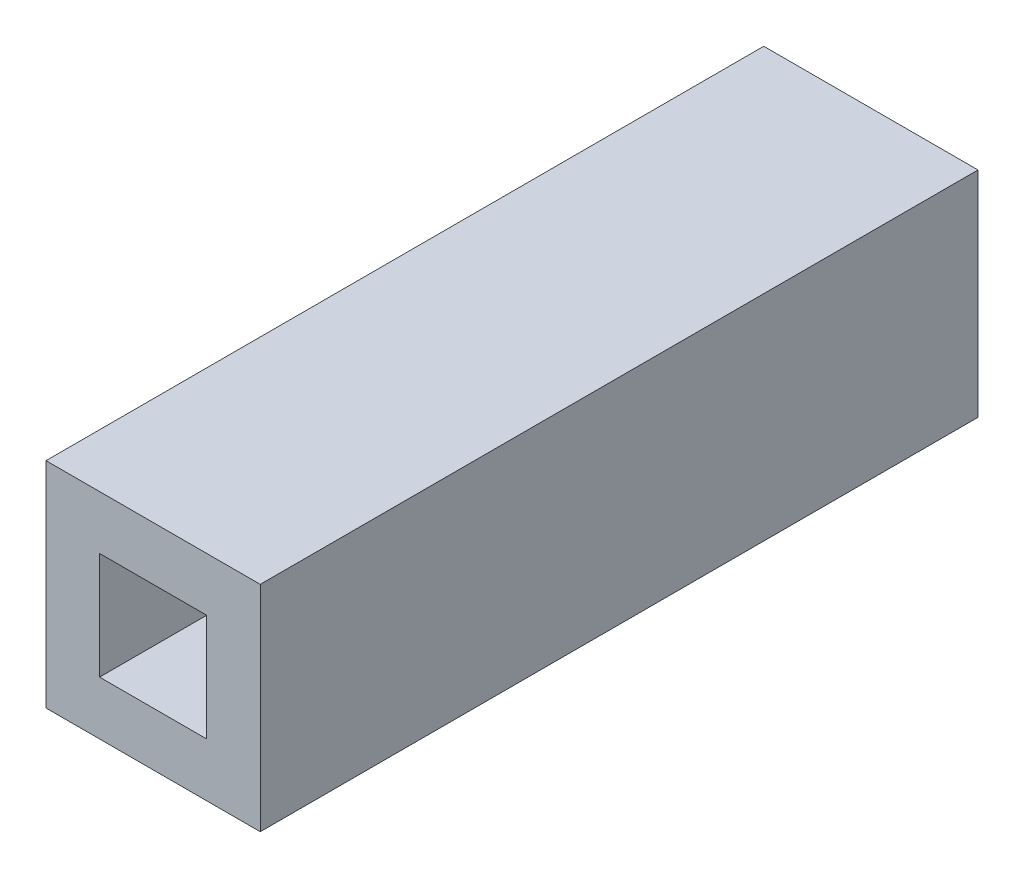
ISO-10303-21;
HEADER;
FILE_DESCRIPTION(('STEP AP214'),'2;1');
FILE_NAME('part.step','',(''),(''),'','','');
FILE_SCHEMA(('AUTOMOTIVE_DESIGN { 1 0 10303 214 1 1 1 1 }'));
ENDSEC;
DATA;
#1=APPLICATION_CONTEXT('core data for automotive mechanical design processes');
#2=APPLICATION_PROTOCOL_DEFINITION('international standard','automotive_design',2000,#1);
#3=PRODUCT_CONTEXT('',#1,'mechanical');
#4=PRODUCT('Part','Part','',(#3));
#5=PRODUCT_RELATED_PRODUCT_CATEGORY('part','',(#4));
#6=PRODUCT_DEFINITION_FORMATION('','',#4);
#7=PRODUCT_DEFINITION_CONTEXT('part definition',#1,'design');
#8=PRODUCT_DEFINITION('design','',#6,#7);
#9=PRODUCT_DEFINITION_SHAPE('','',#8);
#10=(LENGTH_UNIT() NAMED_UNIT(*) SI_UNIT(.MILLI.,.METRE.));
#11=(NAMED_UNIT(*) PLANE_ANGLE_UNIT() SI_UNIT($,.RADIAN.));
#12=(NAMED_UNIT(*) SI_UNIT($,.STERADIAN.) SOLID_ANGLE_UNIT());
#13=UNCERTAINTY_MEASURE_WITH_UNIT(LENGTH_MEASURE(1.E-05),#10,'distance_accuracy_value','');
#14=(GEOMETRIC_REPRESENTATION_CONTEXT(3) GLOBAL_UNCERTAINTY_ASSIGNED_CONTEXT((#13)) GLOBAL_UNIT_ASSIGNED_CONTEXT((#10,
#11,#12)) REPRESENTATION_CONTEXT('',''));
#15=CARTESIAN_POINT('',(0.,0.,0.));
#16=DIRECTION('',(0.,0.,1.));
#17=DIRECTION('',(1.,0.,0.));
#18=AXIS2_PLACEMENT_3D('',#15,#16,#17);
#19=CARTESIAN_POINT('',(0.,0.,67.));
#20=DIRECTION('',(0.,0.,1.));
#21=DIRECTION('',(1.,0.,0.));
#22=AXIS2_PLACEMENT_3D('',#19,#20,#21);
#23=PLANE('',#22);
#24=DIRECTION('',(0.,1.,0.));
#25=VECTOR('',#24,1.);
#26=CARTESIAN_POINT('',(10.,-10.,67.));
#27=LINE('',#26,#25);
#28=CARTESIAN_POINT('',(10.,-10.,67.));
#29=VERTEX_POINT('',#28);
#30=CARTESIAN_POINT('',(10.,10.,67.));
#31=VERTEX_POINT('',#30);
#32=EDGE_CURVE('E158',#29,#31,#27,.T.);
#33=ORIENTED_EDGE('',*,*,#32,.T.);
#34=DIRECTION('',(-1.,0.,0.));
#35=VECTOR('',#34,1.);
#36=CARTESIAN_POINT('',(-10.,10.,67.));
#37=LINE('',#36,#35);
#38=CARTESIAN_POINT('',(-10.,10.,67.));
#39=VERTEX_POINT('',#38);
#40=EDGE_CURVE('E161',#31,#39,#37,.T.);
#41=ORIENTED_EDGE('',*,*,#40,.T.);
#42=DIRECTION('',(0.,-1.,0.));
#43=VECTOR('',#42,1.);
#44=CARTESIAN_POINT('',(-10.,-10.,67.));
#45=LINE('',#44,#43);
#46=CARTESIAN_POINT('',(-10.,-10.,67.));
#47=VERTEX_POINT('',#46);
#48=EDGE_CURVE('E164',#39,#47,#45,.T.);
#49=ORIENTED_EDGE('',*,*,#48,.T.);
#50=DIRECTION('',(1.,0.,0.));
#51=VECTOR('',#50,1.);
#52=CARTESIAN_POINT('',(-10.,-10.,67.));
#53=LINE('',#52,#51);
#54=EDGE_CURVE('E166',#47,#29,#53,.T.);
#55=ORIENTED_EDGE('',*,*,#54,.T.);
#56=EDGE_LOOP('',(#33,#41,#49,#55));
#57=FACE_BOUND('',#56,.T.);
#58=DIRECTION('',(-1.,0.,0.));
#59=VECTOR('',#58,1.);
#60=CARTESIAN_POINT('',(0.,5.,67.));
#61=LINE('',#60,#59);
#62=CARTESIAN_POINT('',(5.,5.,67.));
#63=VERTEX_POINT('',#62);
#64=CARTESIAN_POINT('',(-5.,5.,67.));
#65=VERTEX_POINT('',#64);
#66=EDGE_CURVE('E130',#63,#65,#61,.T.);
#67=ORIENTED_EDGE('',*,*,#66,.F.);
#68=DIRECTION('',(0.,1.,0.));
#69=VECTOR('',#68,1.);
#70=CARTESIAN_POINT('',(5.,0.,67.));
#71=LINE('',#70,#69);
#72=CARTESIAN_POINT('',(5.,-5.,67.));
#73=VERTEX_POINT('',#72);
#74=EDGE_CURVE('E122',#73,#63,#71,.T.);
#75=ORIENTED_EDGE('',*,*,#74,.F.);
#76=DIRECTION('',(1.,0.,0.));
#77=VECTOR('',#76,1.);
#78=CARTESIAN_POINT('',(0.,-5.,67.));
#79=LINE('',#78,#77);
#80=CARTESIAN_POINT('',(-5.,-5.,67.));
#81=VERTEX_POINT('',#80);
#82=EDGE_CURVE('E144',#81,#73,#79,.T.);
#83=ORIENTED_EDGE('',*,*,#82,.F.);
#84=DIRECTION('',(0.,-1.,0.));
#85=VECTOR('',#84,1.);
#86=CARTESIAN_POINT('',(-5.,0.,67.));
#87=LINE('',#86,#85);
#88=EDGE_CURVE('E142',#65,#81,#87,.T.);
#89=ORIENTED_EDGE('',*,*,#88,.F.);
#90=EDGE_LOOP('',(#67,#75,#83,#89));
#91=FACE_BOUND('',#90,.T.);
#92=ADVANCED_FACE('F57',(#57,#91),#23,.T.);
#93=CARTESIAN_POINT('',(0.,0.,0.));
#94=DIRECTION('',(0.,0.,1.));
#95=DIRECTION('',(1.,0.,0.));
#96=AXIS2_PLACEMENT_3D('',#93,#94,#95);
#97=PLANE('',#96);
#98=DIRECTION('',(0.,1.,0.));
#99=VECTOR('',#98,1.);
#100=CARTESIAN_POINT('',(10.,-10.,0.));
#101=LINE('',#100,#99);
#102=CARTESIAN_POINT('',(10.,-10.,0.));
#103=VERTEX_POINT('',#102);
#104=CARTESIAN_POINT('',(10.,10.,0.));
#105=VERTEX_POINT('',#104);
#106=EDGE_CURVE('E138',#103,#105,#101,.T.);
#107=ORIENTED_EDGE('',*,*,#106,.F.);
#108=DIRECTION('',(1.,0.,0.));
#109=VECTOR('',#108,1.);
#110=CARTESIAN_POINT('',(-10.,-10.,0.));
#111=LINE('',#110,#109);
#112=CARTESIAN_POINT('',(-10.,-10.,0.));
#113=VERTEX_POINT('',#112);
#114=EDGE_CURVE('E162',#113,#103,#111,.T.);
#115=ORIENTED_EDGE('',*,*,#114,.F.);
#116=DIRECTION('',(0.,-1.,0.));
#117=VECTOR('',#116,1.);
#118=CARTESIAN_POINT('',(-10.,-10.,0.));
#119=LINE('',#118,#117);
#120=CARTESIAN_POINT('',(-10.,10.,0.));
#121=VERTEX_POINT('',#120);
#122=EDGE_CURVE('E173',#121,#113,#119,.T.);
#123=ORIENTED_EDGE('',*,*,#122,.F.);
#124=DIRECTION('',(-1.,0.,0.));
#125=VECTOR('',#124,1.);
#126=CARTESIAN_POINT('',(-10.,10.,0.));
#127=LINE('',#126,#125);
#128=EDGE_CURVE('E171',#105,#121,#127,.T.);
#129=ORIENTED_EDGE('',*,*,#128,.F.);
#130=EDGE_LOOP('',(#107,#115,#123,#129));
#131=FACE_BOUND('',#130,.T.);
#132=DIRECTION('',(0.,1.,0.));
#133=VECTOR('',#132,1.);
#134=CARTESIAN_POINT('',(5.,0.,0.));
#135=LINE('',#134,#133);
#136=CARTESIAN_POINT('',(5.,-5.,0.));
#137=VERTEX_POINT('',#136);
#138=CARTESIAN_POINT('',(5.,5.,0.));
#139=VERTEX_POINT('',#138);
#140=EDGE_CURVE('E80',#137,#139,#135,.T.);
#141=ORIENTED_EDGE('',*,*,#140,.T.);
#142=DIRECTION('',(-1.,0.,0.));
#143=VECTOR('',#142,1.);
#144=CARTESIAN_POINT('',(0.,5.,0.));
#145=LINE('',#144,#143);
#146=CARTESIAN_POINT('',(-5.,5.,0.));
#147=VERTEX_POINT('',#146);
#148=EDGE_CURVE('E137',#139,#147,#145,.T.);
#149=ORIENTED_EDGE('',*,*,#148,.T.);
#150=DIRECTION('',(0.,-1.,0.));
#151=VECTOR('',#150,1.);
#152=CARTESIAN_POINT('',(-5.,0.,0.));
#153=LINE('',#152,#151);
#154=CARTESIAN_POINT('',(-5.,-5.,0.));
#155=VERTEX_POINT('',#154);
#156=EDGE_CURVE('E150',#147,#155,#153,.T.);
#157=ORIENTED_EDGE('',*,*,#156,.T.);
#158=DIRECTION('',(1.,0.,0.));
#159=VECTOR('',#158,1.);
#160=CARTESIAN_POINT('',(0.,-5.,0.));
#161=LINE('',#160,#159);
#162=EDGE_CURVE('E131',#155,#137,#161,.T.);
#163=ORIENTED_EDGE('',*,*,#162,.T.);
#164=EDGE_LOOP('',(#141,#149,#157,#163));
#165=FACE_BOUND('',#164,.T.);
#166=ADVANCED_FACE('F191',(#131,#165),#97,.F.);
#167=CARTESIAN_POINT('',(10.,-10.,67.));
#168=DIRECTION('',(-1.,0.,0.));
#169=DIRECTION('',(0.,0.,1.));
#170=AXIS2_PLACEMENT_3D('',#167,#168,#169);
#171=PLANE('',#170);
#172=ORIENTED_EDGE('',*,*,#106,.T.);
#173=DIRECTION('',(0.,0.,-1.));
#174=VECTOR('',#173,1.);
#175=CARTESIAN_POINT('',(10.,10.,67.));
#176=LINE('',#175,#174);
#177=EDGE_CURVE('E12',#31,#105,#176,.T.);
#178=ORIENTED_EDGE('',*,*,#177,.F.);
#179=ORIENTED_EDGE('',*,*,#32,.F.);
#180=DIRECTION('',(0.,0.,-1.));
#181=VECTOR('',#180,1.);
#182=CARTESIAN_POINT('',(10.,-10.,67.));
#183=LINE('',#182,#181);
#184=EDGE_CURVE('E168',#29,#103,#183,.T.);
#185=ORIENTED_EDGE('',*,*,#184,.T.);
#186=EDGE_LOOP('',(#172,#178,#179,#185));
#187=FACE_BOUND('',#186,.T.);
#188=ADVANCED_FACE('F59',(#187),#171,.F.);
#189=CARTESIAN_POINT('',(-10.,10.,67.));
#190=DIRECTION('',(0.,-1.,0.));
#191=DIRECTION('',(0.,0.,-1.));
#192=AXIS2_PLACEMENT_3D('',#189,#190,#191);
#193=PLANE('',#192);
#194=ORIENTED_EDGE('',*,*,#128,.T.);
#195=DIRECTION('',(0.,0.,-1.));
#196=VECTOR('',#195,1.);
#197=CARTESIAN_POINT('',(-10.,10.,67.));
#198=LINE('',#197,#196);
#199=EDGE_CURVE('E65',#39,#121,#198,.T.);
#200=ORIENTED_EDGE('',*,*,#199,.F.);
#201=ORIENTED_EDGE('',*,*,#40,.F.);
#202=ORIENTED_EDGE('',*,*,#177,.T.);
#203=EDGE_LOOP('',(#194,#200,#201,#202));
#204=FACE_BOUND('',#203,.T.);
#205=ADVANCED_FACE('F201',(#204),#193,.F.);
#206=CARTESIAN_POINT('',(-10.,-10.,67.));
#207=DIRECTION('',(1.,0.,0.));
#208=DIRECTION('',(0.,0.,-1.));
#209=AXIS2_PLACEMENT_3D('',#206,#207,#208);
#210=PLANE('',#209);
#211=ORIENTED_EDGE('',*,*,#122,.T.);
#212=DIRECTION('',(0.,0.,-1.));
#213=VECTOR('',#212,1.);
#214=CARTESIAN_POINT('',(-10.,-10.,67.));
#215=LINE('',#214,#213);
#216=EDGE_CURVE('E178',#47,#113,#215,.T.);
#217=ORIENTED_EDGE('',*,*,#216,.F.);
#218=ORIENTED_EDGE('',*,*,#48,.F.);
#219=ORIENTED_EDGE('',*,*,#199,.T.);
#220=EDGE_LOOP('',(#211,#217,#218,#219));
#221=FACE_BOUND('',#220,.T.);
#222=ADVANCED_FACE('F185',(#221),#210,.F.);
#223=CARTESIAN_POINT('',(-10.,-10.,67.));
#224=DIRECTION('',(0.,1.,0.));
#225=DIRECTION('',(0.,0.,1.));
#226=AXIS2_PLACEMENT_3D('',#223,#224,#225);
#227=PLANE('',#226);
#228=ORIENTED_EDGE('',*,*,#114,.T.);
#229=ORIENTED_EDGE('',*,*,#184,.F.);
#230=ORIENTED_EDGE('',*,*,#54,.F.);
#231=ORIENTED_EDGE('',*,*,#216,.T.);
#232=EDGE_LOOP('',(#228,#229,#230,#231));
#233=FACE_BOUND('',#232,.T.);
#234=ADVANCED_FACE('F195',(#233),#227,.F.);
#235=CARTESIAN_POINT('',(5.,0.,67.));
#236=DIRECTION('',(-1.,0.,0.));
#237=DIRECTION('',(0.,0.,1.));
#238=AXIS2_PLACEMENT_3D('',#235,#236,#237);
#239=PLANE('',#238);
#240=ORIENTED_EDGE('',*,*,#140,.F.);
#241=DIRECTION('',(0.,0.,-1.));
#242=VECTOR('',#241,1.);
#243=CARTESIAN_POINT('',(5.,-5.,67.));
#244=LINE('',#243,#242);
#245=EDGE_CURVE('E126',#73,#137,#244,.T.);
#246=ORIENTED_EDGE('',*,*,#245,.F.);
#247=ORIENTED_EDGE('',*,*,#74,.T.);
#248=DIRECTION('',(0.,0.,-1.));
#249=VECTOR('',#248,1.);
#250=CARTESIAN_POINT('',(5.,5.,67.));
#251=LINE('',#250,#249);
#252=EDGE_CURVE('E125',#63,#139,#251,.T.);
#253=ORIENTED_EDGE('',*,*,#252,.T.);
#254=EDGE_LOOP('',(#240,#246,#247,#253));
#255=FACE_BOUND('',#254,.T.);
#256=ADVANCED_FACE('F124',(#255),#239,.T.);
#257=CARTESIAN_POINT('',(0.,5.,67.));
#258=DIRECTION('',(0.,-1.,0.));
#259=DIRECTION('',(0.,0.,-1.));
#260=AXIS2_PLACEMENT_3D('',#257,#258,#259);
#261=PLANE('',#260);
#262=ORIENTED_EDGE('',*,*,#148,.F.);
#263=ORIENTED_EDGE('',*,*,#252,.F.);
#264=ORIENTED_EDGE('',*,*,#66,.T.);
#265=DIRECTION('',(0.,0.,-1.));
#266=VECTOR('',#265,1.);
#267=CARTESIAN_POINT('',(-5.,5.,67.));
#268=LINE('',#267,#266);
#269=EDGE_CURVE('E139',#65,#147,#268,.T.);
#270=ORIENTED_EDGE('',*,*,#269,.T.);
#271=EDGE_LOOP('',(#262,#263,#264,#270));
#272=FACE_BOUND('',#271,.T.);
#273=ADVANCED_FACE('F134',(#272),#261,.T.);
#274=CARTESIAN_POINT('',(-5.,0.,67.));
#275=DIRECTION('',(1.,0.,0.));
#276=DIRECTION('',(0.,0.,-1.));
#277=AXIS2_PLACEMENT_3D('',#274,#275,#276);
#278=PLANE('',#277);
#279=ORIENTED_EDGE('',*,*,#156,.F.);
#280=ORIENTED_EDGE('',*,*,#269,.F.);
#281=ORIENTED_EDGE('',*,*,#88,.T.);
#282=DIRECTION('',(0.,0.,-1.));
#283=VECTOR('',#282,1.);
#284=CARTESIAN_POINT('',(-5.,-5.,67.));
#285=LINE('',#284,#283);
#286=EDGE_CURVE('E72',#81,#155,#285,.T.);
#287=ORIENTED_EDGE('',*,*,#286,.T.);
#288=EDGE_LOOP('',(#279,#280,#281,#287));
#289=FACE_BOUND('',#288,.T.);
#290=ADVANCED_FACE('F224',(#289),#278,.T.);
#291=CARTESIAN_POINT('',(0.,-5.,67.));
#292=DIRECTION('',(0.,1.,0.));
#293=DIRECTION('',(0.,0.,1.));
#294=AXIS2_PLACEMENT_3D('',#291,#292,#293);
#295=PLANE('',#294);
#296=ORIENTED_EDGE('',*,*,#162,.F.);
#297=ORIENTED_EDGE('',*,*,#286,.F.);
#298=ORIENTED_EDGE('',*,*,#82,.T.);
#299=ORIENTED_EDGE('',*,*,#245,.T.);
#300=EDGE_LOOP('',(#296,#297,#298,#299));
#301=FACE_BOUND('',#300,.T.);
#302=ADVANCED_FACE('F228',(#301),#295,.T.);
#303=CLOSED_SHELL('',(#92,#166,#188,#205,#222,#234,#256,#273,#290,#302));
#304=MANIFOLD_SOLID_BREP('B2',#303);
#305=ADVANCED_BREP_SHAPE_REPRESENTATION('',(#18,#304),#14);
#306=SHAPE_DEFINITION_REPRESENTATION(#9,#305);
ENDSEC;
END-ISO-10303-21;
